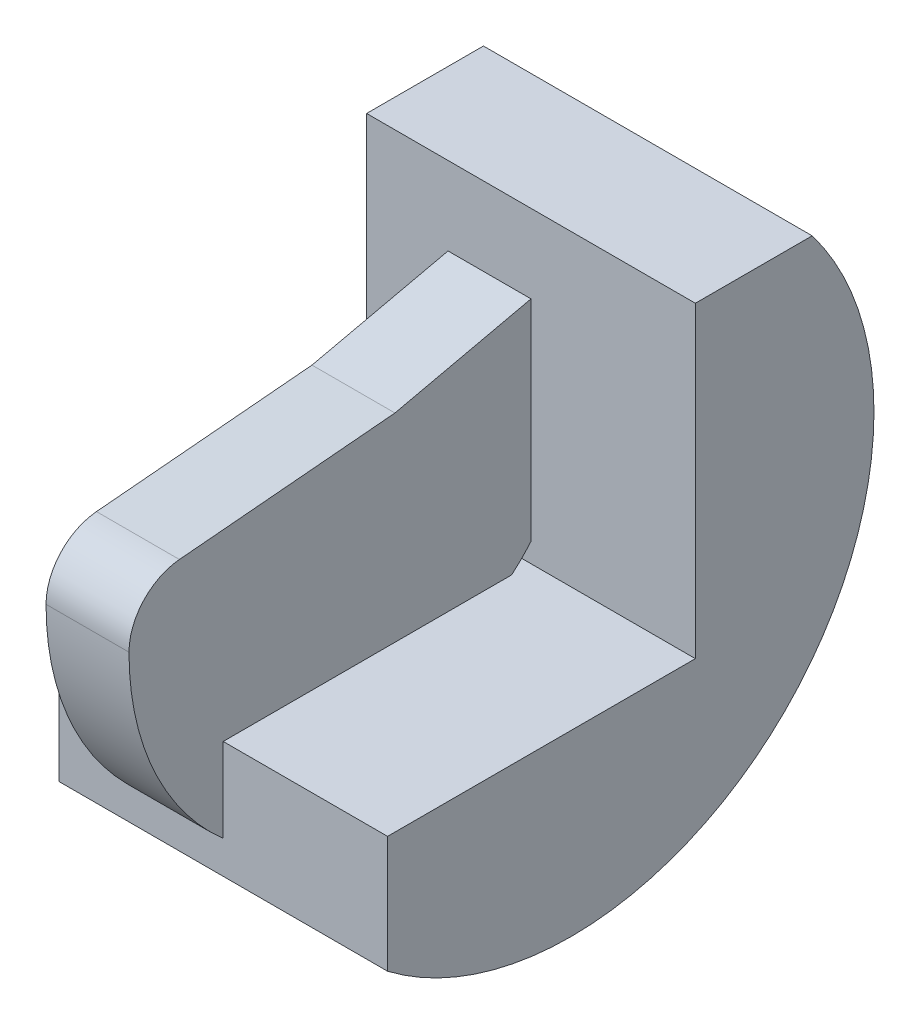
ISO-10303-21;
HEADER;
FILE_DESCRIPTION(('STEP AP214'),'2;1');
FILE_NAME('part.step','',(''),(''),'','','');
FILE_SCHEMA(('AUTOMOTIVE_DESIGN { 1 0 10303 214 1 1 1 1 }'));
ENDSEC;
DATA;
#1=APPLICATION_CONTEXT('core data for automotive mechanical design processes');
#2=APPLICATION_PROTOCOL_DEFINITION('international standard','automotive_design',2000,#1);
#3=PRODUCT_CONTEXT('',#1,'mechanical');
#4=PRODUCT('Part','Part','',(#3));
#5=PRODUCT_RELATED_PRODUCT_CATEGORY('part','',(#4));
#6=PRODUCT_DEFINITION_FORMATION('','',#4);
#7=PRODUCT_DEFINITION_CONTEXT('part definition',#1,'design');
#8=PRODUCT_DEFINITION('design','',#6,#7);
#9=PRODUCT_DEFINITION_SHAPE('','',#8);
#10=(LENGTH_UNIT() NAMED_UNIT(*) SI_UNIT(.MILLI.,.METRE.));
#11=(NAMED_UNIT(*) PLANE_ANGLE_UNIT() SI_UNIT($,.RADIAN.));
#12=(NAMED_UNIT(*) SI_UNIT($,.STERADIAN.) SOLID_ANGLE_UNIT());
#13=UNCERTAINTY_MEASURE_WITH_UNIT(LENGTH_MEASURE(1.E-05),#10,'distance_accuracy_value','');
#14=(GEOMETRIC_REPRESENTATION_CONTEXT(3) GLOBAL_UNCERTAINTY_ASSIGNED_CONTEXT((#13)) GLOBAL_UNIT_ASSIGNED_CONTEXT((#10,
#11,#12)) REPRESENTATION_CONTEXT('',''));
#15=CARTESIAN_POINT('',(0.,0.,0.));
#16=DIRECTION('',(0.,0.,1.));
#17=DIRECTION('',(1.,0.,0.));
#18=AXIS2_PLACEMENT_3D('',#15,#16,#17);
#19=CARTESIAN_POINT('',(-25.3583404622037,-9.00000000000019,13.265));
#20=DIRECTION('',(0.,1.,0.));
#21=DIRECTION('',(0.,0.,1.));
#22=AXIS2_PLACEMENT_3D('',#19,#20,#21);
#23=PLANE('',#22);
#24=DIRECTION('',(0.,0.,1.));
#25=VECTOR('',#24,1.);
#26=CARTESIAN_POINT('',(30.2900000000001,-9.00000000000011,13.2649999999998));
#27=LINE('',#26,#25);
#28=CARTESIAN_POINT('',(30.29,-8.99999999999988,-7.59500000000098));
#29=VERTEX_POINT('',#28);
#30=CARTESIAN_POINT('',(30.2900000000001,-9.00000000000011,13.2649999999999));
#31=VERTEX_POINT('',#30);
#32=EDGE_CURVE('E182',#29,#31,#27,.T.);
#33=ORIENTED_EDGE('',*,*,#32,.F.);
#34=DIRECTION('',(1.,0.,0.));
#35=VECTOR('',#34,1.);
#36=CARTESIAN_POINT('',(-11.9087796488563,-9.0000000000003,-7.59500000000053));
#37=LINE('',#36,#35);
#38=CARTESIAN_POINT('',(36.29,-8.99999999999987,-7.59500000000098));
#39=VERTEX_POINT('',#38);
#40=EDGE_CURVE('E152',#29,#39,#37,.T.);
#41=ORIENTED_EDGE('',*,*,#40,.T.);
#42=DIRECTION('',(0.,0.,-1.));
#43=VECTOR('',#42,1.);
#44=CARTESIAN_POINT('',(36.2900000000001,-9.0000000000001,13.2649999999999));
#45=LINE('',#44,#43);
#46=CARTESIAN_POINT('',(36.2900000000001,-9.0000000000001,13.2649999999999));
#47=VERTEX_POINT('',#46);
#48=EDGE_CURVE('E164',#47,#39,#45,.T.);
#49=ORIENTED_EDGE('',*,*,#48,.F.);
#50=DIRECTION('',(1.,0.,0.));
#51=VECTOR('',#50,1.);
#52=CARTESIAN_POINT('',(-25.3583404622037,-9.00000000000019,13.265));
#53=LINE('',#52,#51);
#54=CARTESIAN_POINT('',(48.1800000000001,-9.00000000000008,13.2649999999999));
#55=VERTEX_POINT('',#54);
#56=EDGE_CURVE('E219',#47,#55,#53,.T.);
#57=ORIENTED_EDGE('',*,*,#56,.T.);
#58=DIRECTION('',(0.,0.,1.));
#59=VECTOR('',#58,1.);
#60=CARTESIAN_POINT('',(48.1800000000001,-9.00000000000008,13.2649999999999));
#61=LINE('',#60,#59);
#62=CARTESIAN_POINT('',(48.1800000000001,-8.99999999999985,-9.0000000000001));
#63=VERTEX_POINT('',#62);
#64=EDGE_CURVE('E193',#63,#55,#61,.T.);
#65=ORIENTED_EDGE('',*,*,#64,.F.);
#66=DIRECTION('',(1.,0.,0.));
#67=VECTOR('',#66,1.);
#68=CARTESIAN_POINT('',(-25.3583404622037,-8.99999999999996,-9.00000000000004));
#69=LINE('',#68,#67);
#70=CARTESIAN_POINT('',(24.4,-8.99999999999996,-9.00000000000008));
#71=VERTEX_POINT('',#70);
#72=EDGE_CURVE('E220',#71,#63,#69,.T.);
#73=ORIENTED_EDGE('',*,*,#72,.F.);
#74=DIRECTION('',(0.,0.,1.));
#75=VECTOR('',#74,1.);
#76=CARTESIAN_POINT('',(24.4000000000001,-9.00000000000012,13.2649999999998));
#77=LINE('',#76,#75);
#78=CARTESIAN_POINT('',(24.4000000000001,-9.00000000000012,13.265));
#79=VERTEX_POINT('',#78);
#80=EDGE_CURVE('E216',#71,#79,#77,.T.);
#81=ORIENTED_EDGE('',*,*,#80,.T.);
#82=EDGE_CURVE('E215',#79,#31,#53,.T.);
#83=ORIENTED_EDGE('',*,*,#82,.T.);
#84=EDGE_LOOP('',(#33,#41,#49,#57,#65,#73,#81,#83));
#85=FACE_BOUND('',#84,.T.);
#86=ADVANCED_FACE('F33',(#85),#23,.T.);
#87=CARTESIAN_POINT('',(24.4,22.9276479717651,7.59500000000001));
#88=DIRECTION('',(-1.,0.,0.));
#89=DIRECTION('',(0.,0.,-1.));
#90=AXIS2_PLACEMENT_3D('',#87,#88,#89);
#91=PLANE('',#90);
#92=CARTESIAN_POINT('',(24.4,0.,0.));
#93=DIRECTION('',(-1.,0.,0.));
#94=DIRECTION('',(0.,0.,1.));
#95=AXIS2_PLACEMENT_3D('',#92,#93,#94);
#96=CIRCLE('',#95,21.9194599614133);
#97=CARTESIAN_POINT('',(24.4000000000001,-17.4500000000002,13.2649999999998));
#98=VERTEX_POINT('',#97);
#99=CARTESIAN_POINT('',(24.4,13.2649999999999,-17.4500000000001));
#100=VERTEX_POINT('',#99);
#101=EDGE_CURVE('E207',#98,#100,#96,.F.);
#102=ORIENTED_EDGE('',*,*,#101,.F.);
#103=DIRECTION('',(0.,-1.,0.));
#104=VECTOR('',#103,1.);
#105=CARTESIAN_POINT('',(24.4000000000001,-17.4500000000001,13.2649999999998));
#106=LINE('',#105,#104);
#107=EDGE_CURVE('E212',#79,#98,#106,.T.);
#108=ORIENTED_EDGE('',*,*,#107,.F.);
#109=ORIENTED_EDGE('',*,*,#80,.F.);
#110=DIRECTION('',(0.,-1.,0.));
#111=VECTOR('',#110,1.);
#112=CARTESIAN_POINT('',(24.4,-8.99999999999991,-9.00000000000008));
#113=LINE('',#112,#111);
#114=CARTESIAN_POINT('',(24.4,13.2649999999999,-9.00000000000008));
#115=VERTEX_POINT('',#114);
#116=EDGE_CURVE('E221',#115,#71,#113,.T.);
#117=ORIENTED_EDGE('',*,*,#116,.F.);
#118=DIRECTION('',(0.,0.,1.));
#119=VECTOR('',#118,1.);
#120=CARTESIAN_POINT('',(24.4,13.2649999999999,-17.4500000000002));
#121=LINE('',#120,#119);
#122=EDGE_CURVE('E192',#100,#115,#121,.T.);
#123=ORIENTED_EDGE('',*,*,#122,.F.);
#124=EDGE_LOOP('',(#102,#108,#109,#117,#123));
#125=FACE_BOUND('',#124,.T.);
#126=ADVANCED_FACE('F35',(#125),#91,.T.);
#127=CARTESIAN_POINT('',(48.1800000000001,0.,-1.06244368298486E-13));
#128=DIRECTION('',(-1.,0.,0.));
#129=DIRECTION('',(0.,-1.,0.));
#130=AXIS2_PLACEMENT_3D('',#127,#128,#129);
#131=PLANE('',#130);
#132=CARTESIAN_POINT('',(48.1800000000001,0.,-1.06244368298486E-13));
#133=DIRECTION('',(1.,0.,0.));
#134=DIRECTION('',(0.,-1.,0.));
#135=AXIS2_PLACEMENT_3D('',#132,#133,#134);
#136=CIRCLE('',#135,21.9194599614133);
#137=CARTESIAN_POINT('',(48.1800000000001,-17.4500000000001,13.2649999999998));
#138=VERTEX_POINT('',#137);
#139=CARTESIAN_POINT('',(48.18,13.265,-17.4500000000001));
#140=VERTEX_POINT('',#139);
#141=EDGE_CURVE('E188',#138,#140,#136,.T.);
#142=ORIENTED_EDGE('',*,*,#141,.T.);
#143=DIRECTION('',(0.,0.,1.));
#144=VECTOR('',#143,1.);
#145=CARTESIAN_POINT('',(48.18,13.265,-17.4500000000001));
#146=LINE('',#145,#144);
#147=CARTESIAN_POINT('',(48.18,13.265,-9.0000000000001));
#148=VERTEX_POINT('',#147);
#149=EDGE_CURVE('E199',#140,#148,#146,.T.);
#150=ORIENTED_EDGE('',*,*,#149,.T.);
#151=DIRECTION('',(0.,-1.,0.));
#152=VECTOR('',#151,1.);
#153=CARTESIAN_POINT('',(48.1800000000001,-8.99999999999985,-9.0000000000001));
#154=LINE('',#153,#152);
#155=EDGE_CURVE('E196',#148,#63,#154,.T.);
#156=ORIENTED_EDGE('',*,*,#155,.T.);
#157=ORIENTED_EDGE('',*,*,#64,.T.);
#158=DIRECTION('',(0.,-1.,0.));
#159=VECTOR('',#158,1.);
#160=CARTESIAN_POINT('',(48.1800000000001,-17.4500000000001,13.2649999999998));
#161=LINE('',#160,#159);
#162=EDGE_CURVE('E189',#55,#138,#161,.T.);
#163=ORIENTED_EDGE('',*,*,#162,.T.);
#164=EDGE_LOOP('',(#142,#150,#156,#157,#163));
#165=FACE_BOUND('',#164,.T.);
#166=ADVANCED_FACE('F238',(#165),#131,.F.);
#167=CARTESIAN_POINT('',(-25.3583404622038,13.2649999999999,-17.45));
#168=DIRECTION('',(0.,1.,0.));
#169=DIRECTION('',(-1.,0.,0.));
#170=AXIS2_PLACEMENT_3D('',#167,#168,#169);
#171=PLANE('',#170);
#172=DIRECTION('',(1.,0.,0.));
#173=VECTOR('',#172,1.);
#174=CARTESIAN_POINT('',(-25.3583404622038,13.2649999999999,-17.45));
#175=LINE('',#174,#173);
#176=EDGE_CURVE('E210',#100,#140,#175,.T.);
#177=ORIENTED_EDGE('',*,*,#176,.F.);
#178=ORIENTED_EDGE('',*,*,#122,.T.);
#179=DIRECTION('',(1.,0.,0.));
#180=VECTOR('',#179,1.);
#181=CARTESIAN_POINT('',(-25.3583404622038,13.2649999999999,-9.00000000000004));
#182=LINE('',#181,#180);
#183=EDGE_CURVE('E206',#115,#148,#182,.T.);
#184=ORIENTED_EDGE('',*,*,#183,.T.);
#185=ORIENTED_EDGE('',*,*,#149,.F.);
#186=EDGE_LOOP('',(#177,#178,#184,#185));
#187=FACE_BOUND('',#186,.T.);
#188=ADVANCED_FACE('F263',(#187),#171,.T.);
#189=CARTESIAN_POINT('',(-25.3583404622037,-8.99999999999996,-9.00000000000004));
#190=DIRECTION('',(0.,0.,1.));
#191=DIRECTION('',(1.,0.,0.));
#192=AXIS2_PLACEMENT_3D('',#189,#190,#191);
#193=PLANE('',#192);
#194=DIRECTION('',(1.,0.,0.));
#195=VECTOR('',#194,1.);
#196=CARTESIAN_POINT('',(-11.9087796488563,-7.59500000000076,-9.00000000000005));
#197=LINE('',#196,#195);
#198=CARTESIAN_POINT('',(30.29,-7.59500000000069,-9.00000000000008));
#199=VERTEX_POINT('',#198);
#200=CARTESIAN_POINT('',(36.29,-7.59500000000068,-9.00000000000009));
#201=VERTEX_POINT('',#200);
#202=EDGE_CURVE('E48',#199,#201,#197,.T.);
#203=ORIENTED_EDGE('',*,*,#202,.F.);
#204=DIRECTION('',(0.,-1.,0.));
#205=VECTOR('',#204,1.);
#206=CARTESIAN_POINT('',(30.29,-8.9999999999999,-9.00000000000008));
#207=LINE('',#206,#205);
#208=CARTESIAN_POINT('',(30.29,7.59499999999941,-9.00000000000027));
#209=VERTEX_POINT('',#208);
#210=EDGE_CURVE('E185',#209,#199,#207,.T.);
#211=ORIENTED_EDGE('',*,*,#210,.F.);
#212=DIRECTION('',(1.,0.,0.));
#213=VECTOR('',#212,1.);
#214=CARTESIAN_POINT('',(-11.9087796488563,7.59499999999935,-9.00000000000022));
#215=LINE('',#214,#213);
#216=CARTESIAN_POINT('',(36.29,7.59499999999939,-9.00000000000009));
#217=VERTEX_POINT('',#216);
#218=EDGE_CURVE('E174',#209,#217,#215,.T.);
#219=ORIENTED_EDGE('',*,*,#218,.T.);
#220=DIRECTION('',(0.,1.,0.));
#221=VECTOR('',#220,1.);
#222=CARTESIAN_POINT('',(36.29,-8.99999999999985,-9.00000000000009));
#223=LINE('',#222,#221);
#224=EDGE_CURVE('E53',#201,#217,#223,.T.);
#225=ORIENTED_EDGE('',*,*,#224,.F.);
#226=EDGE_LOOP('',(#203,#211,#219,#225));
#227=FACE_BOUND('',#226,.T.);
#228=ORIENTED_EDGE('',*,*,#183,.F.);
#229=ORIENTED_EDGE('',*,*,#116,.T.);
#230=ORIENTED_EDGE('',*,*,#72,.T.);
#231=ORIENTED_EDGE('',*,*,#155,.F.);
#232=EDGE_LOOP('',(#228,#229,#230,#231));
#233=FACE_BOUND('',#232,.T.);
#234=ADVANCED_FACE('F243',(#227,#233),#193,.T.);
#235=CARTESIAN_POINT('',(-25.3583404622037,-17.4500000000002,13.2649999999999));
#236=DIRECTION('',(0.,0.,1.));
#237=DIRECTION('',(0.,-1.,0.));
#238=AXIS2_PLACEMENT_3D('',#235,#236,#237);
#239=PLANE('',#238);
#240=DIRECTION('',(0.,-1.,0.));
#241=VECTOR('',#240,1.);
#242=CARTESIAN_POINT('',(30.2900000000001,-17.4500000000001,13.2649999999998));
#243=LINE('',#242,#241);
#244=CARTESIAN_POINT('',(30.2900000000001,-15.0746865639073,13.2649999999998));
#245=VERTEX_POINT('',#244);
#246=EDGE_CURVE('E11',#31,#245,#243,.T.);
#247=ORIENTED_EDGE('',*,*,#246,.F.);
#248=ORIENTED_EDGE('',*,*,#82,.F.);
#249=ORIENTED_EDGE('',*,*,#107,.T.);
#250=DIRECTION('',(1.,0.,0.));
#251=VECTOR('',#250,1.);
#252=CARTESIAN_POINT('',(-25.3583404622037,-17.4500000000002,13.2649999999999));
#253=LINE('',#252,#251);
#254=EDGE_CURVE('E211',#98,#138,#253,.T.);
#255=ORIENTED_EDGE('',*,*,#254,.T.);
#256=ORIENTED_EDGE('',*,*,#162,.F.);
#257=ORIENTED_EDGE('',*,*,#56,.F.);
#258=DIRECTION('',(0.,1.,0.));
#259=VECTOR('',#258,1.);
#260=CARTESIAN_POINT('',(36.2900000000001,-17.4500000000001,13.2649999999998));
#261=LINE('',#260,#259);
#262=CARTESIAN_POINT('',(36.2900000000001,-15.0746865639073,13.2649999999998));
#263=VERTEX_POINT('',#262);
#264=EDGE_CURVE('E41',#263,#47,#261,.T.);
#265=ORIENTED_EDGE('',*,*,#264,.F.);
#266=DIRECTION('',(1.,0.,0.));
#267=VECTOR('',#266,1.);
#268=CARTESIAN_POINT('',(-11.9087796488562,-15.0746865639074,13.2649999999999));
#269=LINE('',#268,#267);
#270=EDGE_CURVE('E151',#245,#263,#269,.T.);
#271=ORIENTED_EDGE('',*,*,#270,.F.);
#272=EDGE_LOOP('',(#247,#248,#249,#255,#256,#257,#265,#271));
#273=FACE_BOUND('',#272,.T.);
#274=ADVANCED_FACE('F232',(#273),#239,.T.);
#275=CARTESIAN_POINT('',(-25.3583404622037,0.,0.));
#276=DIRECTION('',(1.,0.,0.));
#277=DIRECTION('',(0.,1.,0.));
#278=AXIS2_PLACEMENT_3D('',#275,#276,#277);
#279=CYLINDRICAL_SURFACE('',#278,21.9194599614133);
#280=ORIENTED_EDGE('',*,*,#254,.F.);
#281=ORIENTED_EDGE('',*,*,#101,.T.);
#282=ORIENTED_EDGE('',*,*,#176,.T.);
#283=ORIENTED_EDGE('',*,*,#141,.F.);
#284=EDGE_LOOP('',(#280,#281,#282,#283));
#285=FACE_BOUND('',#284,.T.);
#286=ADVANCED_FACE('F269',(#285),#279,.T.);
#287=CARTESIAN_POINT('',(30.29,0.,1.18620285396929E-13));
#288=DIRECTION('',(-1.,0.,0.));
#289=DIRECTION('',(0.,0.,-1.));
#290=AXIS2_PLACEMENT_3D('',#287,#288,#289);
#291=PLANE('',#290);
#292=DIRECTION('',(0.,-0.22083252150854,0.975311743723093));
#293=VECTOR('',#292,1.);
#294=CARTESIAN_POINT('',(30.29,7.59499999999943,-9.00000000000032));
#295=LINE('',#294,#293);
#296=CARTESIAN_POINT('',(30.29,5.36664987300019,0.841557906157786));
#297=VERTEX_POINT('',#296);
#298=EDGE_CURVE('E171',#209,#297,#295,.T.);
#299=ORIENTED_EDGE('',*,*,#298,.F.);
#300=ORIENTED_EDGE('',*,*,#210,.T.);
#301=CARTESIAN_POINT('',(30.29,-5.31142561450345E-13,-3.03733172585933E-13));
#302=DIRECTION('',(-1.,0.,0.));
#303=DIRECTION('',(0.,0.,1.));
#304=AXIS2_PLACEMENT_3D('',#301,#302,#303);
#305=CIRCLE('',#304,11.7764181736213);
#306=EDGE_CURVE('E155',#29,#199,#305,.F.);
#307=ORIENTED_EDGE('',*,*,#306,.F.);
#308=ORIENTED_EDGE('',*,*,#32,.T.);
#309=ORIENTED_EDGE('',*,*,#246,.T.);
#310=CARTESIAN_POINT('',(30.29,-5.31088351341721E-13,-3.03733172585933E-13));
#311=DIRECTION('',(-1.,0.,0.));
#312=DIRECTION('',(0.,0.,1.));
#313=AXIS2_PLACEMENT_3D('',#310,#311,#312);
#314=CIRCLE('',#313,20.0800000000009);
#315=CARTESIAN_POINT('',(30.2900000000001,-3.58210567229083E-13,20.0800000000005));
#316=VERTEX_POINT('',#315);
#317=EDGE_CURVE('E137',#316,#245,#314,.F.);
#318=ORIENTED_EDGE('',*,*,#317,.F.);
#319=CARTESIAN_POINT('',(30.2900000000001,-3.58210567229083E-13,16.0800000000005));
#320=DIRECTION('',(-1.,0.,0.));
#321=DIRECTION('',(0.,0.,1.));
#322=AXIS2_PLACEMENT_3D('',#319,#320,#321);
#323=CIRCLE('',#322,4.);
#324=CARTESIAN_POINT('',(30.2900000000001,3.98437270605338,16.4332338308463));
#325=VERTEX_POINT('',#324);
#326=EDGE_CURVE('E133',#325,#316,#323,.F.);
#327=ORIENTED_EDGE('',*,*,#326,.F.);
#328=DIRECTION('',(0.,-0.0883084577114538,0.996093176513435));
#329=VECTOR('',#328,1.);
#330=CARTESIAN_POINT('',(30.29,5.36664987300021,0.841557906157688));
#331=LINE('',#330,#329);
#332=EDGE_CURVE('E167',#297,#325,#331,.T.);
#333=ORIENTED_EDGE('',*,*,#332,.F.);
#334=EDGE_LOOP('',(#299,#300,#307,#308,#309,#318,#327,#333));
#335=FACE_BOUND('',#334,.T.);
#336=ADVANCED_FACE('F249',(#335),#291,.T.);
#337=CARTESIAN_POINT('',(36.2900000000001,-16.0800000000005,-3.06888990951097E-13));
#338=DIRECTION('',(1.,0.,0.));
#339=DIRECTION('',(0.,1.,0.));
#340=AXIS2_PLACEMENT_3D('',#337,#338,#339);
#341=PLANE('',#340);
#342=CARTESIAN_POINT('',(36.29,-5.20662028531647E-13,-3.08623714427074E-13));
#343=DIRECTION('',(1.,0.,0.));
#344=DIRECTION('',(0.,-1.,0.));
#345=AXIS2_PLACEMENT_3D('',#342,#343,#344);
#346=CIRCLE('',#345,11.7764181736213);
#347=EDGE_CURVE('E161',#39,#201,#346,.T.);
#348=ORIENTED_EDGE('',*,*,#347,.T.);
#349=ORIENTED_EDGE('',*,*,#224,.T.);
#350=DIRECTION('',(0.,-0.22083252150854,0.975311743723093));
#351=VECTOR('',#350,1.);
#352=CARTESIAN_POINT('',(36.29,7.59499999999943,-9.00000000000027));
#353=LINE('',#352,#351);
#354=CARTESIAN_POINT('',(36.29,5.36664987300021,0.841557906157748));
#355=VERTEX_POINT('',#354);
#356=EDGE_CURVE('E159',#217,#355,#353,.T.);
#357=ORIENTED_EDGE('',*,*,#356,.T.);
#358=DIRECTION('',(0.,-0.0883084577114538,0.996093176513435));
#359=VECTOR('',#358,1.);
#360=CARTESIAN_POINT('',(36.29,5.36664987300021,0.841557906157748));
#361=LINE('',#360,#359);
#362=CARTESIAN_POINT('',(36.29,3.98437270605339,16.4332338308463));
#363=VERTEX_POINT('',#362);
#364=EDGE_CURVE('E147',#355,#363,#361,.T.);
#365=ORIENTED_EDGE('',*,*,#364,.T.);
#366=CARTESIAN_POINT('',(36.2900000000001,-3.47730034310385E-13,16.0800000000005));
#367=DIRECTION('',(1.,0.,0.));
#368=DIRECTION('',(0.,1.,0.));
#369=AXIS2_PLACEMENT_3D('',#366,#367,#368);
#370=CIRCLE('',#369,4.);
#371=CARTESIAN_POINT('',(36.2900000000001,-3.04852540804949E-13,20.0800000000005));
#372=VERTEX_POINT('',#371);
#373=EDGE_CURVE('E131',#363,#372,#370,.T.);
#374=ORIENTED_EDGE('',*,*,#373,.T.);
#375=CARTESIAN_POINT('',(36.29,-5.20607818423023E-13,-3.08623714427074E-13));
#376=DIRECTION('',(1.,0.,0.));
#377=DIRECTION('',(0.,1.,0.));
#378=AXIS2_PLACEMENT_3D('',#375,#376,#377);
#379=CIRCLE('',#378,20.0800000000009);
#380=EDGE_CURVE('E144',#372,#263,#379,.T.);
#381=ORIENTED_EDGE('',*,*,#380,.T.);
#382=ORIENTED_EDGE('',*,*,#264,.T.);
#383=ORIENTED_EDGE('',*,*,#48,.T.);
#384=EDGE_LOOP('',(#348,#349,#357,#365,#374,#381,#382,#383));
#385=FACE_BOUND('',#384,.T.);
#386=ADVANCED_FACE('F142',(#385),#341,.T.);
#387=CARTESIAN_POINT('',(-11.9087796488563,-6.04853511323466E-13,-2.69337356332965E-13));
#388=DIRECTION('',(1.,0.,0.));
#389=DIRECTION('',(0.,1.,0.));
#390=AXIS2_PLACEMENT_3D('',#387,#388,#389);
#391=CYLINDRICAL_SURFACE('',#390,11.7764181736213);
#392=ORIENTED_EDGE('',*,*,#306,.T.);
#393=ORIENTED_EDGE('',*,*,#202,.T.);
#394=ORIENTED_EDGE('',*,*,#347,.F.);
#395=ORIENTED_EDGE('',*,*,#40,.F.);
#396=EDGE_LOOP('',(#392,#393,#394,#395));
#397=FACE_BOUND('',#396,.T.);
#398=ADVANCED_FACE('F254',(#397),#391,.T.);
#399=CARTESIAN_POINT('',(-11.9087796488563,7.59499999999935,-9.00000000000023));
#400=DIRECTION('',(0.,0.975311743723093,0.22083252150854));
#401=DIRECTION('',(0.,-0.22083252150854,0.975311743723093));
#402=AXIS2_PLACEMENT_3D('',#399,#400,#401);
#403=PLANE('',#402);
#404=ORIENTED_EDGE('',*,*,#218,.F.);
#405=ORIENTED_EDGE('',*,*,#298,.T.);
#406=DIRECTION('',(1.,0.,0.));
#407=VECTOR('',#406,1.);
#408=CARTESIAN_POINT('',(-11.9087796488563,5.36664987300013,0.841557906157787));
#409=LINE('',#408,#407);
#410=EDGE_CURVE('E170',#297,#355,#409,.T.);
#411=ORIENTED_EDGE('',*,*,#410,.T.);
#412=ORIENTED_EDGE('',*,*,#356,.F.);
#413=EDGE_LOOP('',(#404,#405,#411,#412));
#414=FACE_BOUND('',#413,.T.);
#415=ADVANCED_FACE('F258',(#414),#403,.T.);
#416=CARTESIAN_POINT('',(-11.9087796488563,5.36664987300013,0.841557906157787));
#417=DIRECTION('',(0.,0.996093176513435,0.0883084577114538));
#418=DIRECTION('',(0.,-0.0883084577114538,0.996093176513435));
#419=AXIS2_PLACEMENT_3D('',#416,#417,#418);
#420=PLANE('',#419);
#421=ORIENTED_EDGE('',*,*,#410,.F.);
#422=ORIENTED_EDGE('',*,*,#332,.T.);
#423=DIRECTION('',(1.,0.,0.));
#424=VECTOR('',#423,1.);
#425=CARTESIAN_POINT('',(-11.9087796488563,3.98437270605331,16.4332338308463));
#426=LINE('',#425,#424);
#427=EDGE_CURVE('E166',#325,#363,#426,.T.);
#428=ORIENTED_EDGE('',*,*,#427,.T.);
#429=ORIENTED_EDGE('',*,*,#364,.F.);
#430=EDGE_LOOP('',(#421,#422,#428,#429));
#431=FACE_BOUND('',#430,.T.);
#432=ADVANCED_FACE('F261',(#431),#420,.T.);
#433=CARTESIAN_POINT('',(-11.9087796488563,-4.31921517102203E-13,16.0800000000005));
#434=DIRECTION('',(1.,0.,0.));
#435=DIRECTION('',(0.,1.,0.));
#436=AXIS2_PLACEMENT_3D('',#433,#434,#435);
#437=CYLINDRICAL_SURFACE('',#436,4.);
#438=ORIENTED_EDGE('',*,*,#427,.F.);
#439=ORIENTED_EDGE('',*,*,#326,.T.);
#440=DIRECTION('',(1.,0.,0.));
#441=VECTOR('',#440,1.);
#442=CARTESIAN_POINT('',(-11.9087796488563,-3.89044023596768E-13,20.0800000000005));
#443=LINE('',#442,#441);
#444=EDGE_CURVE('E127',#316,#372,#443,.T.);
#445=ORIENTED_EDGE('',*,*,#444,.T.);
#446=ORIENTED_EDGE('',*,*,#373,.F.);
#447=EDGE_LOOP('',(#438,#439,#445,#446));
#448=FACE_BOUND('',#447,.T.);
#449=ADVANCED_FACE('F130',(#448),#437,.T.);
#450=CARTESIAN_POINT('',(-11.9087796488563,-6.04799301214841E-13,-2.69337356332965E-13));
#451=DIRECTION('',(1.,0.,0.));
#452=DIRECTION('',(0.,1.,0.));
#453=AXIS2_PLACEMENT_3D('',#450,#451,#452);
#454=CYLINDRICAL_SURFACE('',#453,20.0800000000009);
#455=ORIENTED_EDGE('',*,*,#317,.T.);
#456=ORIENTED_EDGE('',*,*,#270,.T.);
#457=ORIENTED_EDGE('',*,*,#380,.F.);
#458=ORIENTED_EDGE('',*,*,#444,.F.);
#459=EDGE_LOOP('',(#455,#456,#457,#458));
#460=FACE_BOUND('',#459,.T.);
#461=ADVANCED_FACE('F150',(#460),#454,.T.);
#462=CLOSED_SHELL('',(#86,#126,#166,#188,#234,#274,#286,#336,#386,#398,#415,#432,#449,#461));
#463=MANIFOLD_SOLID_BREP('B2',#462);
#464=ADVANCED_BREP_SHAPE_REPRESENTATION('',(#18,#463),#14);
#465=SHAPE_DEFINITION_REPRESENTATION(#9,#464);
ENDSEC;
END-ISO-10303-21;
